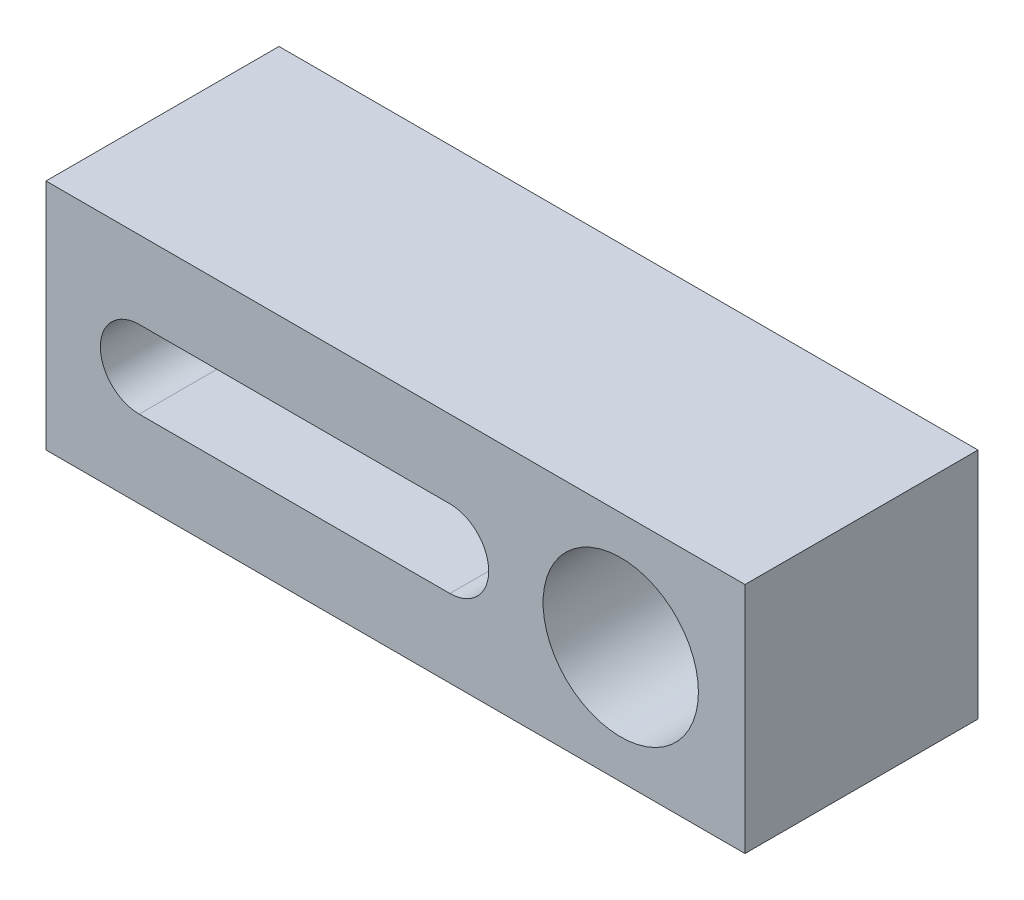
ISO-10303-21;
HEADER;
FILE_DESCRIPTION(('STEP AP214'),'2;1');
FILE_NAME('part.step','',(''),(''),'','','');
FILE_SCHEMA(('AUTOMOTIVE_DESIGN { 1 0 10303 214 1 1 1 1 }'));
ENDSEC;
DATA;
#1=APPLICATION_CONTEXT('core data for automotive mechanical design processes');
#2=APPLICATION_PROTOCOL_DEFINITION('international standard','automotive_design',2000,#1);
#3=PRODUCT_CONTEXT('',#1,'mechanical');
#4=PRODUCT('Part','Part','',(#3));
#5=PRODUCT_RELATED_PRODUCT_CATEGORY('part','',(#4));
#6=PRODUCT_DEFINITION_FORMATION('','',#4);
#7=PRODUCT_DEFINITION_CONTEXT('part definition',#1,'design');
#8=PRODUCT_DEFINITION('design','',#6,#7);
#9=PRODUCT_DEFINITION_SHAPE('','',#8);
#10=(LENGTH_UNIT() NAMED_UNIT(*) SI_UNIT(.MILLI.,.METRE.));
#11=(NAMED_UNIT(*) PLANE_ANGLE_UNIT() SI_UNIT($,.RADIAN.));
#12=(NAMED_UNIT(*) SI_UNIT($,.STERADIAN.) SOLID_ANGLE_UNIT());
#13=UNCERTAINTY_MEASURE_WITH_UNIT(LENGTH_MEASURE(1.E-05),#10,'distance_accuracy_value','');
#14=(GEOMETRIC_REPRESENTATION_CONTEXT(3) GLOBAL_UNCERTAINTY_ASSIGNED_CONTEXT((#13)) GLOBAL_UNIT_ASSIGNED_CONTEXT((#10,
#11,#12)) REPRESENTATION_CONTEXT('',''));
#15=CARTESIAN_POINT('',(0.,0.,0.));
#16=DIRECTION('',(0.,0.,1.));
#17=DIRECTION('',(1.,0.,0.));
#18=AXIS2_PLACEMENT_3D('',#15,#16,#17);
#19=CARTESIAN_POINT('',(0.,0.,15.));
#20=DIRECTION('',(0.,0.,1.));
#21=DIRECTION('',(1.,0.,0.));
#22=AXIS2_PLACEMENT_3D('',#19,#20,#21);
#23=PLANE('',#22);
#24=DIRECTION('',(-1.,0.,0.));
#25=VECTOR('',#24,1.);
#26=CARTESIAN_POINT('',(3.5,2.50000000000001,15.));
#27=LINE('',#26,#25);
#28=CARTESIAN_POINT('',(3.5,2.50000000000001,15.));
#29=VERTEX_POINT('',#28);
#30=CARTESIAN_POINT('',(-16.5,2.5,15.));
#31=VERTEX_POINT('',#30);
#32=EDGE_CURVE('E105',#29,#31,#27,.T.);
#33=ORIENTED_EDGE('',*,*,#32,.F.);
#34=CARTESIAN_POINT('',(3.5,0.,15.));
#35=DIRECTION('',(0.,0.,1.));
#36=DIRECTION('',(1.,0.,0.));
#37=AXIS2_PLACEMENT_3D('',#34,#35,#36);
#38=CIRCLE('',#37,2.5);
#39=CARTESIAN_POINT('',(3.5,-2.5,15.));
#40=VERTEX_POINT('',#39);
#41=EDGE_CURVE('E97',#40,#29,#38,.T.);
#42=ORIENTED_EDGE('',*,*,#41,.F.);
#43=DIRECTION('',(1.,0.,0.));
#44=VECTOR('',#43,1.);
#45=CARTESIAN_POINT('',(3.5,-2.5,15.));
#46=LINE('',#45,#44);
#47=CARTESIAN_POINT('',(-16.5,-2.5,15.));
#48=VERTEX_POINT('',#47);
#49=EDGE_CURVE('E120',#48,#40,#46,.T.);
#50=ORIENTED_EDGE('',*,*,#49,.F.);
#51=CARTESIAN_POINT('',(-16.5,0.,15.));
#52=DIRECTION('',(0.,0.,1.));
#53=DIRECTION('',(1.,0.,0.));
#54=AXIS2_PLACEMENT_3D('',#51,#52,#53);
#55=CIRCLE('',#54,2.5);
#56=EDGE_CURVE('E118',#31,#48,#55,.T.);
#57=ORIENTED_EDGE('',*,*,#56,.F.);
#58=EDGE_LOOP('',(#33,#42,#50,#57));
#59=FACE_BOUND('',#58,.T.);
#60=DIRECTION('',(0.,-1.,0.));
#61=VECTOR('',#60,1.);
#62=CARTESIAN_POINT('',(-22.5,-7.5,15.));
#63=LINE('',#62,#61);
#64=CARTESIAN_POINT('',(-22.5,7.5,15.));
#65=VERTEX_POINT('',#64);
#66=CARTESIAN_POINT('',(-22.5,-7.5,15.));
#67=VERTEX_POINT('',#66);
#68=EDGE_CURVE('E136',#65,#67,#63,.T.);
#69=ORIENTED_EDGE('',*,*,#68,.T.);
#70=DIRECTION('',(1.,0.,0.));
#71=VECTOR('',#70,1.);
#72=CARTESIAN_POINT('',(22.5,-7.5,15.));
#73=LINE('',#72,#71);
#74=CARTESIAN_POINT('',(22.5,-7.5,15.));
#75=VERTEX_POINT('',#74);
#76=EDGE_CURVE('E139',#67,#75,#73,.T.);
#77=ORIENTED_EDGE('',*,*,#76,.T.);
#78=DIRECTION('',(0.,1.,0.));
#79=VECTOR('',#78,1.);
#80=CARTESIAN_POINT('',(22.5,-7.5,15.));
#81=LINE('',#80,#79);
#82=CARTESIAN_POINT('',(22.5,7.5,15.));
#83=VERTEX_POINT('',#82);
#84=EDGE_CURVE('E142',#75,#83,#81,.T.);
#85=ORIENTED_EDGE('',*,*,#84,.T.);
#86=DIRECTION('',(-1.,0.,0.));
#87=VECTOR('',#86,1.);
#88=CARTESIAN_POINT('',(22.5,7.5,15.));
#89=LINE('',#88,#87);
#90=EDGE_CURVE('E144',#83,#65,#89,.T.);
#91=ORIENTED_EDGE('',*,*,#90,.T.);
#92=EDGE_LOOP('',(#69,#77,#85,#91));
#93=FACE_BOUND('',#92,.T.);
#94=CARTESIAN_POINT('',(14.5,0.,15.));
#95=DIRECTION('',(0.,0.,1.));
#96=DIRECTION('',(1.,0.,0.));
#97=AXIS2_PLACEMENT_3D('',#94,#95,#96);
#98=CIRCLE('',#97,5.);
#99=CARTESIAN_POINT('',(19.5,0.,15.));
#100=VERTEX_POINT('',#99);
#101=EDGE_CURVE('E126',#100,#100,#98,.T.);
#102=ORIENTED_EDGE('',*,*,#101,.F.);
#103=EDGE_LOOP('',(#102));
#104=FACE_BOUND('',#103,.T.);
#105=ADVANCED_FACE('F32',(#59,#93,#104),#23,.T.);
#106=CARTESIAN_POINT('',(0.,0.,0.));
#107=DIRECTION('',(0.,0.,1.));
#108=DIRECTION('',(1.,0.,0.));
#109=AXIS2_PLACEMENT_3D('',#106,#107,#108);
#110=PLANE('',#109);
#111=DIRECTION('',(0.,-1.,0.));
#112=VECTOR('',#111,1.);
#113=CARTESIAN_POINT('',(-22.5,-7.5,0.));
#114=LINE('',#113,#112);
#115=CARTESIAN_POINT('',(-22.5,7.5,0.));
#116=VERTEX_POINT('',#115);
#117=CARTESIAN_POINT('',(-22.5,-7.5,0.));
#118=VERTEX_POINT('',#117);
#119=EDGE_CURVE('E113',#116,#118,#114,.T.);
#120=ORIENTED_EDGE('',*,*,#119,.F.);
#121=DIRECTION('',(-1.,0.,0.));
#122=VECTOR('',#121,1.);
#123=CARTESIAN_POINT('',(22.5,7.5,0.));
#124=LINE('',#123,#122);
#125=CARTESIAN_POINT('',(22.5,7.5,0.));
#126=VERTEX_POINT('',#125);
#127=EDGE_CURVE('E140',#126,#116,#124,.T.);
#128=ORIENTED_EDGE('',*,*,#127,.F.);
#129=DIRECTION('',(0.,1.,0.));
#130=VECTOR('',#129,1.);
#131=CARTESIAN_POINT('',(22.5,-7.5,0.));
#132=LINE('',#131,#130);
#133=CARTESIAN_POINT('',(22.5,-7.5,0.));
#134=VERTEX_POINT('',#133);
#135=EDGE_CURVE('E151',#134,#126,#132,.T.);
#136=ORIENTED_EDGE('',*,*,#135,.F.);
#137=DIRECTION('',(1.,0.,0.));
#138=VECTOR('',#137,1.);
#139=CARTESIAN_POINT('',(22.5,-7.5,0.));
#140=LINE('',#139,#138);
#141=EDGE_CURVE('E149',#118,#134,#140,.T.);
#142=ORIENTED_EDGE('',*,*,#141,.F.);
#143=EDGE_LOOP('',(#120,#128,#136,#142));
#144=FACE_BOUND('',#143,.T.);
#145=CARTESIAN_POINT('',(3.5,0.,0.));
#146=DIRECTION('',(0.,0.,1.));
#147=DIRECTION('',(1.,0.,0.));
#148=AXIS2_PLACEMENT_3D('',#145,#146,#147);
#149=CIRCLE('',#148,2.5);
#150=CARTESIAN_POINT('',(3.5,-2.5,0.));
#151=VERTEX_POINT('',#150);
#152=CARTESIAN_POINT('',(3.5,2.50000000000001,0.));
#153=VERTEX_POINT('',#152);
#154=EDGE_CURVE('E55',#151,#153,#149,.T.);
#155=ORIENTED_EDGE('',*,*,#154,.T.);
#156=DIRECTION('',(-1.,0.,0.));
#157=VECTOR('',#156,1.);
#158=CARTESIAN_POINT('',(3.5,2.50000000000001,0.));
#159=LINE('',#158,#157);
#160=CARTESIAN_POINT('',(-16.5,2.5,0.));
#161=VERTEX_POINT('',#160);
#162=EDGE_CURVE('E112',#153,#161,#159,.T.);
#163=ORIENTED_EDGE('',*,*,#162,.T.);
#164=CARTESIAN_POINT('',(-16.5,0.,0.));
#165=DIRECTION('',(0.,0.,1.));
#166=DIRECTION('',(1.,0.,0.));
#167=AXIS2_PLACEMENT_3D('',#164,#165,#166);
#168=CIRCLE('',#167,2.5);
#169=CARTESIAN_POINT('',(-16.5,-2.5,0.));
#170=VERTEX_POINT('',#169);
#171=EDGE_CURVE('E128',#161,#170,#168,.T.);
#172=ORIENTED_EDGE('',*,*,#171,.T.);
#173=DIRECTION('',(1.,0.,0.));
#174=VECTOR('',#173,1.);
#175=CARTESIAN_POINT('',(3.5,-2.5,0.));
#176=LINE('',#175,#174);
#177=EDGE_CURVE('E106',#170,#151,#176,.T.);
#178=ORIENTED_EDGE('',*,*,#177,.T.);
#179=EDGE_LOOP('',(#155,#163,#172,#178));
#180=FACE_BOUND('',#179,.T.);
#181=CARTESIAN_POINT('',(14.5,0.,0.));
#182=DIRECTION('',(0.,0.,1.));
#183=DIRECTION('',(1.,0.,0.));
#184=AXIS2_PLACEMENT_3D('',#181,#182,#183);
#185=CIRCLE('',#184,5.);
#186=CARTESIAN_POINT('',(19.5,0.,0.));
#187=VERTEX_POINT('',#186);
#188=EDGE_CURVE('E222',#187,#187,#185,.T.);
#189=ORIENTED_EDGE('',*,*,#188,.T.);
#190=EDGE_LOOP('',(#189));
#191=FACE_BOUND('',#190,.T.);
#192=ADVANCED_FACE('F169',(#144,#180,#191),#110,.F.);
#193=CARTESIAN_POINT('',(-22.5,-7.5,15.));
#194=DIRECTION('',(1.,0.,0.));
#195=DIRECTION('',(0.,0.,-1.));
#196=AXIS2_PLACEMENT_3D('',#193,#194,#195);
#197=PLANE('',#196);
#198=ORIENTED_EDGE('',*,*,#119,.T.);
#199=DIRECTION('',(0.,0.,-1.));
#200=VECTOR('',#199,1.);
#201=CARTESIAN_POINT('',(-22.5,-7.5,15.));
#202=LINE('',#201,#200);
#203=EDGE_CURVE('E11',#67,#118,#202,.T.);
#204=ORIENTED_EDGE('',*,*,#203,.F.);
#205=ORIENTED_EDGE('',*,*,#68,.F.);
#206=DIRECTION('',(0.,0.,-1.));
#207=VECTOR('',#206,1.);
#208=CARTESIAN_POINT('',(-22.5,7.5,15.));
#209=LINE('',#208,#207);
#210=EDGE_CURVE('E146',#65,#116,#209,.T.);
#211=ORIENTED_EDGE('',*,*,#210,.T.);
#212=EDGE_LOOP('',(#198,#204,#205,#211));
#213=FACE_BOUND('',#212,.T.);
#214=ADVANCED_FACE('F34',(#213),#197,.F.);
#215=CARTESIAN_POINT('',(22.5,-7.5,15.));
#216=DIRECTION('',(0.,1.,0.));
#217=DIRECTION('',(-1.,0.,0.));
#218=AXIS2_PLACEMENT_3D('',#215,#216,#217);
#219=PLANE('',#218);
#220=ORIENTED_EDGE('',*,*,#141,.T.);
#221=DIRECTION('',(0.,0.,-1.));
#222=VECTOR('',#221,1.);
#223=CARTESIAN_POINT('',(22.5,-7.5,15.));
#224=LINE('',#223,#222);
#225=EDGE_CURVE('E40',#75,#134,#224,.T.);
#226=ORIENTED_EDGE('',*,*,#225,.F.);
#227=ORIENTED_EDGE('',*,*,#76,.F.);
#228=ORIENTED_EDGE('',*,*,#203,.T.);
#229=EDGE_LOOP('',(#220,#226,#227,#228));
#230=FACE_BOUND('',#229,.T.);
#231=ADVANCED_FACE('F179',(#230),#219,.F.);
#232=CARTESIAN_POINT('',(22.5,-7.5,15.));
#233=DIRECTION('',(-1.,0.,0.));
#234=DIRECTION('',(0.,0.,1.));
#235=AXIS2_PLACEMENT_3D('',#232,#233,#234);
#236=PLANE('',#235);
#237=ORIENTED_EDGE('',*,*,#135,.T.);
#238=DIRECTION('',(0.,0.,-1.));
#239=VECTOR('',#238,1.);
#240=CARTESIAN_POINT('',(22.5,7.5,15.));
#241=LINE('',#240,#239);
#242=EDGE_CURVE('E156',#83,#126,#241,.T.);
#243=ORIENTED_EDGE('',*,*,#242,.F.);
#244=ORIENTED_EDGE('',*,*,#84,.F.);
#245=ORIENTED_EDGE('',*,*,#225,.T.);
#246=EDGE_LOOP('',(#237,#243,#244,#245));
#247=FACE_BOUND('',#246,.T.);
#248=ADVANCED_FACE('F163',(#247),#236,.F.);
#249=CARTESIAN_POINT('',(22.5,7.5,15.));
#250=DIRECTION('',(0.,-1.,0.));
#251=DIRECTION('',(1.,0.,0.));
#252=AXIS2_PLACEMENT_3D('',#249,#250,#251);
#253=PLANE('',#252);
#254=ORIENTED_EDGE('',*,*,#127,.T.);
#255=ORIENTED_EDGE('',*,*,#210,.F.);
#256=ORIENTED_EDGE('',*,*,#90,.F.);
#257=ORIENTED_EDGE('',*,*,#242,.T.);
#258=EDGE_LOOP('',(#254,#255,#256,#257));
#259=FACE_BOUND('',#258,.T.);
#260=ADVANCED_FACE('F173',(#259),#253,.F.);
#261=CARTESIAN_POINT('',(3.5,0.,15.));
#262=DIRECTION('',(0.,0.,-1.));
#263=DIRECTION('',(-1.,0.,0.));
#264=AXIS2_PLACEMENT_3D('',#261,#262,#263);
#265=CYLINDRICAL_SURFACE('',#264,2.5);
#266=ORIENTED_EDGE('',*,*,#154,.F.);
#267=DIRECTION('',(0.,0.,-1.));
#268=VECTOR('',#267,1.);
#269=CARTESIAN_POINT('',(3.5,-2.5,15.));
#270=LINE('',#269,#268);
#271=EDGE_CURVE('E101',#40,#151,#270,.T.);
#272=ORIENTED_EDGE('',*,*,#271,.F.);
#273=ORIENTED_EDGE('',*,*,#41,.T.);
#274=DIRECTION('',(0.,0.,-1.));
#275=VECTOR('',#274,1.);
#276=CARTESIAN_POINT('',(3.5,2.50000000000001,15.));
#277=LINE('',#276,#275);
#278=EDGE_CURVE('E100',#29,#153,#277,.T.);
#279=ORIENTED_EDGE('',*,*,#278,.T.);
#280=EDGE_LOOP('',(#266,#272,#273,#279));
#281=FACE_BOUND('',#280,.T.);
#282=ADVANCED_FACE('F99',(#281),#265,.F.);
#283=CARTESIAN_POINT('',(3.5,2.50000000000001,15.));
#284=DIRECTION('',(0.,-1.,0.));
#285=DIRECTION('',(1.,0.,0.));
#286=AXIS2_PLACEMENT_3D('',#283,#284,#285);
#287=PLANE('',#286);
#288=ORIENTED_EDGE('',*,*,#162,.F.);
#289=ORIENTED_EDGE('',*,*,#278,.F.);
#290=ORIENTED_EDGE('',*,*,#32,.T.);
#291=DIRECTION('',(0.,0.,-1.));
#292=VECTOR('',#291,1.);
#293=CARTESIAN_POINT('',(-16.5,2.5,15.));
#294=LINE('',#293,#292);
#295=EDGE_CURVE('E114',#31,#161,#294,.T.);
#296=ORIENTED_EDGE('',*,*,#295,.T.);
#297=EDGE_LOOP('',(#288,#289,#290,#296));
#298=FACE_BOUND('',#297,.T.);
#299=ADVANCED_FACE('F109',(#298),#287,.T.);
#300=CARTESIAN_POINT('',(-16.5,0.,15.));
#301=DIRECTION('',(0.,0.,-1.));
#302=DIRECTION('',(-1.,0.,0.));
#303=AXIS2_PLACEMENT_3D('',#300,#301,#302);
#304=CYLINDRICAL_SURFACE('',#303,2.5);
#305=ORIENTED_EDGE('',*,*,#171,.F.);
#306=ORIENTED_EDGE('',*,*,#295,.F.);
#307=ORIENTED_EDGE('',*,*,#56,.T.);
#308=DIRECTION('',(0.,0.,-1.));
#309=VECTOR('',#308,1.);
#310=CARTESIAN_POINT('',(-16.5,-2.5,15.));
#311=LINE('',#310,#309);
#312=EDGE_CURVE('E47',#48,#170,#311,.T.);
#313=ORIENTED_EDGE('',*,*,#312,.T.);
#314=EDGE_LOOP('',(#305,#306,#307,#313));
#315=FACE_BOUND('',#314,.T.);
#316=ADVANCED_FACE('F202',(#315),#304,.F.);
#317=CARTESIAN_POINT('',(3.5,-2.5,15.));
#318=DIRECTION('',(0.,1.,0.));
#319=DIRECTION('',(-1.,0.,0.));
#320=AXIS2_PLACEMENT_3D('',#317,#318,#319);
#321=PLANE('',#320);
#322=ORIENTED_EDGE('',*,*,#177,.F.);
#323=ORIENTED_EDGE('',*,*,#312,.F.);
#324=ORIENTED_EDGE('',*,*,#49,.T.);
#325=ORIENTED_EDGE('',*,*,#271,.T.);
#326=EDGE_LOOP('',(#322,#323,#324,#325));
#327=FACE_BOUND('',#326,.T.);
#328=ADVANCED_FACE('F206',(#327),#321,.T.);
#329=CARTESIAN_POINT('',(14.5,0.,15.));
#330=DIRECTION('',(0.,0.,-1.));
#331=DIRECTION('',(-1.,0.,0.));
#332=AXIS2_PLACEMENT_3D('',#329,#330,#331);
#333=CYLINDRICAL_SURFACE('',#332,5.);
#334=ORIENTED_EDGE('',*,*,#101,.T.);
#335=EDGE_LOOP('',(#334));
#336=FACE_BOUND('',#335,.T.);
#337=ORIENTED_EDGE('',*,*,#188,.F.);
#338=EDGE_LOOP('',(#337));
#339=FACE_BOUND('',#338,.T.);
#340=ADVANCED_FACE('F212',(#336,#339),#333,.F.);
#341=CLOSED_SHELL('',(#105,#192,#214,#231,#248,#260,#282,#299,#316,#328,#340));
#342=MANIFOLD_SOLID_BREP('B2',#341);
#343=ADVANCED_BREP_SHAPE_REPRESENTATION('',(#18,#342),#14);
#344=SHAPE_DEFINITION_REPRESENTATION(#9,#343);
ENDSEC;
END-ISO-10303-21;
